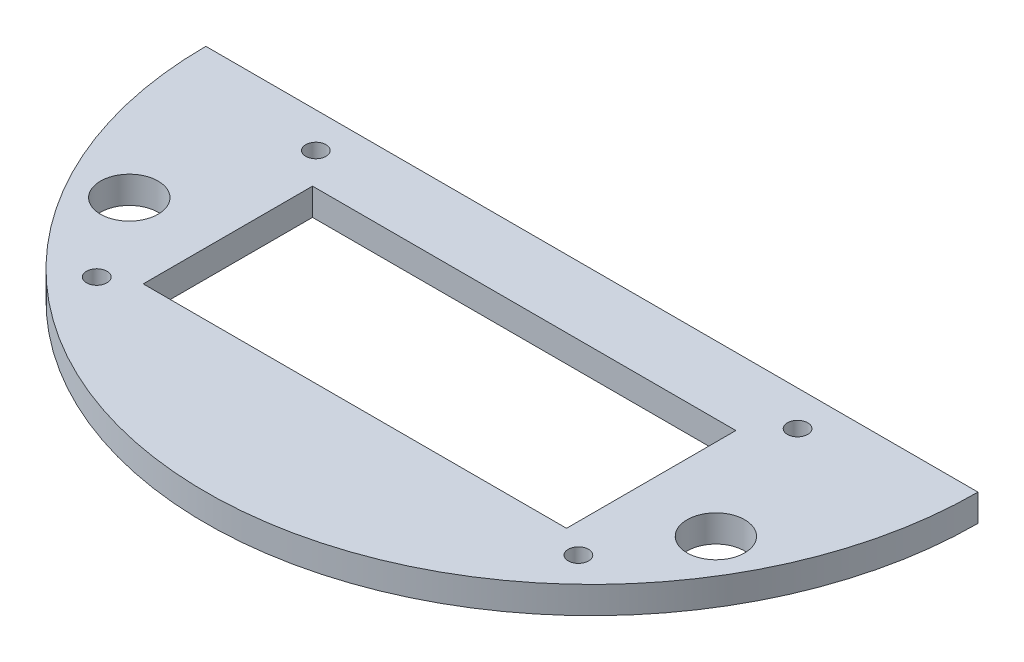
ISO-10303-21;
HEADER;
FILE_DESCRIPTION(('STEP AP214'),'2;1');
FILE_NAME('part.step','',(''),(''),'','','');
FILE_SCHEMA(('AUTOMOTIVE_DESIGN { 1 0 10303 214 1 1 1 1 }'));
ENDSEC;
DATA;
#1=APPLICATION_CONTEXT('core data for automotive mechanical design processes');
#2=APPLICATION_PROTOCOL_DEFINITION('international standard','automotive_design',2000,#1);
#3=PRODUCT_CONTEXT('',#1,'mechanical');
#4=PRODUCT('Part','Part','',(#3));
#5=PRODUCT_RELATED_PRODUCT_CATEGORY('part','',(#4));
#6=PRODUCT_DEFINITION_FORMATION('','',#4);
#7=PRODUCT_DEFINITION_CONTEXT('part definition',#1,'design');
#8=PRODUCT_DEFINITION('design','',#6,#7);
#9=PRODUCT_DEFINITION_SHAPE('','',#8);
#10=(LENGTH_UNIT() NAMED_UNIT(*) SI_UNIT(.MILLI.,.METRE.));
#11=(NAMED_UNIT(*) PLANE_ANGLE_UNIT() SI_UNIT($,.RADIAN.));
#12=(NAMED_UNIT(*) SI_UNIT($,.STERADIAN.) SOLID_ANGLE_UNIT());
#13=UNCERTAINTY_MEASURE_WITH_UNIT(LENGTH_MEASURE(1.E-05),#10,'distance_accuracy_value','');
#14=(GEOMETRIC_REPRESENTATION_CONTEXT(3) GLOBAL_UNCERTAINTY_ASSIGNED_CONTEXT((#13)) GLOBAL_UNIT_ASSIGNED_CONTEXT((#10,
#11,#12)) REPRESENTATION_CONTEXT('',''));
#15=CARTESIAN_POINT('',(0.,0.,0.));
#16=DIRECTION('',(0.,0.,1.));
#17=DIRECTION('',(1.,0.,0.));
#18=AXIS2_PLACEMENT_3D('',#15,#16,#17);
#19=CARTESIAN_POINT('',(0.,4.,0.));
#20=DIRECTION('',(0.,1.,0.));
#21=DIRECTION('',(0.,0.,1.));
#22=AXIS2_PLACEMENT_3D('',#19,#20,#21);
#23=PLANE('',#22);
#24=CARTESIAN_POINT('',(35.5570716121792,4.,37.5545789256541));
#25=DIRECTION('',(0.,1.,0.));
#26=DIRECTION('',(0.,0.,1.));
#27=AXIS2_PLACEMENT_3D('',#24,#25,#26);
#28=CIRCLE('',#27,1.5);
#29=CARTESIAN_POINT('',(35.5570716121792,4.,39.0545789256541));
#30=VERTEX_POINT('',#29);
#31=EDGE_CURVE('E313',#30,#30,#28,.T.);
#32=ORIENTED_EDGE('',*,*,#31,.F.);
#33=EDGE_LOOP('',(#32));
#34=FACE_BOUND('',#33,.T.);
#35=CARTESIAN_POINT('',(-35.5570716121792,4.,37.5545789256541));
#36=DIRECTION('',(0.,1.,0.));
#37=DIRECTION('',(0.,0.,1.));
#38=AXIS2_PLACEMENT_3D('',#35,#36,#37);
#39=CIRCLE('',#38,1.5);
#40=CARTESIAN_POINT('',(-35.5570716121792,4.,39.0545789256541));
#41=VERTEX_POINT('',#40);
#42=EDGE_CURVE('E307',#41,#41,#39,.T.);
#43=ORIENTED_EDGE('',*,*,#42,.F.);
#44=EDGE_LOOP('',(#43));
#45=FACE_BOUND('',#44,.T.);
#46=CARTESIAN_POINT('',(-35.5570716121792,4.,5.19850640774449));
#47=DIRECTION('',(0.,1.,0.));
#48=DIRECTION('',(0.,0.,1.));
#49=AXIS2_PLACEMENT_3D('',#46,#47,#48);
#50=CIRCLE('',#49,1.5);
#51=CARTESIAN_POINT('',(-35.5570716121792,4.,6.69850640774449));
#52=VERTEX_POINT('',#51);
#53=EDGE_CURVE('E301',#52,#52,#50,.T.);
#54=ORIENTED_EDGE('',*,*,#53,.F.);
#55=EDGE_LOOP('',(#54));
#56=FACE_BOUND('',#55,.T.);
#57=CARTESIAN_POINT('',(35.5570716121792,4.,5.19850640774448));
#58=DIRECTION('',(0.,1.,0.));
#59=DIRECTION('',(0.,0.,1.));
#60=AXIS2_PLACEMENT_3D('',#57,#58,#59);
#61=CIRCLE('',#60,1.5);
#62=CARTESIAN_POINT('',(35.5570716121792,4.,6.69850640774448));
#63=VERTEX_POINT('',#62);
#64=EDGE_CURVE('E290',#63,#63,#61,.T.);
#65=ORIENTED_EDGE('',*,*,#64,.F.);
#66=EDGE_LOOP('',(#65));
#67=FACE_BOUND('',#66,.T.);
#68=CARTESIAN_POINT('',(43.3012701892219,4.,25.0000000000002));
#69=DIRECTION('',(0.,1.,0.));
#70=DIRECTION('',(0.,0.,1.));
#71=AXIS2_PLACEMENT_3D('',#68,#69,#70);
#72=CIRCLE('',#71,4.25);
#73=CARTESIAN_POINT('',(43.3012701892219,4.,29.2500000000002));
#74=VERTEX_POINT('',#73);
#75=EDGE_CURVE('E115',#74,#74,#72,.T.);
#76=ORIENTED_EDGE('',*,*,#75,.F.);
#77=EDGE_LOOP('',(#76));
#78=FACE_BOUND('',#77,.T.);
#79=CARTESIAN_POINT('',(0.,4.,0.));
#80=DIRECTION('',(0.,1.,0.));
#81=DIRECTION('',(0.,0.,1.));
#82=AXIS2_PLACEMENT_3D('',#79,#80,#81);
#83=CIRCLE('',#82,57.);
#84=CARTESIAN_POINT('',(-57.,4.,0.));
#85=VERTEX_POINT('',#84);
#86=CARTESIAN_POINT('',(57.,4.,0.));
#87=VERTEX_POINT('',#86);
#88=EDGE_CURVE('E125',#85,#87,#83,.T.);
#89=ORIENTED_EDGE('',*,*,#88,.T.);
#90=DIRECTION('',(-1.,0.,0.));
#91=VECTOR('',#90,1.);
#92=CARTESIAN_POINT('',(-57.,4.,0.));
#93=LINE('',#92,#91);
#94=EDGE_CURVE('E128',#87,#85,#93,.T.);
#95=ORIENTED_EDGE('',*,*,#94,.T.);
#96=EDGE_LOOP('',(#89,#95));
#97=FACE_BOUND('',#96,.T.);
#98=DIRECTION('',(-1.,0.,0.));
#99=VECTOR('',#98,1.);
#100=CARTESIAN_POINT('',(-31.25,4.,9.99999999999999));
#101=LINE('',#100,#99);
#102=CARTESIAN_POINT('',(31.25,4.,9.99999999999999));
#103=VERTEX_POINT('',#102);
#104=CARTESIAN_POINT('',(-31.25,4.,9.99999999999999));
#105=VERTEX_POINT('',#104);
#106=EDGE_CURVE('E94',#103,#105,#101,.T.);
#107=ORIENTED_EDGE('',*,*,#106,.F.);
#108=DIRECTION('',(0.,0.,-1.));
#109=VECTOR('',#108,1.);
#110=CARTESIAN_POINT('',(31.25,4.,9.99999999999999));
#111=LINE('',#110,#109);
#112=CARTESIAN_POINT('',(31.25,4.,35.));
#113=VERTEX_POINT('',#112);
#114=EDGE_CURVE('E86',#113,#103,#111,.T.);
#115=ORIENTED_EDGE('',*,*,#114,.F.);
#116=DIRECTION('',(1.,0.,0.));
#117=VECTOR('',#116,1.);
#118=CARTESIAN_POINT('',(-31.25,4.,35.));
#119=LINE('',#118,#117);
#120=CARTESIAN_POINT('',(-31.25,4.,35.));
#121=VERTEX_POINT('',#120);
#122=EDGE_CURVE('E109',#121,#113,#119,.T.);
#123=ORIENTED_EDGE('',*,*,#122,.F.);
#124=DIRECTION('',(0.,0.,1.));
#125=VECTOR('',#124,1.);
#126=CARTESIAN_POINT('',(-31.25,4.,9.99999999999999));
#127=LINE('',#126,#125);
#128=EDGE_CURVE('E107',#105,#121,#127,.T.);
#129=ORIENTED_EDGE('',*,*,#128,.F.);
#130=EDGE_LOOP('',(#107,#115,#123,#129));
#131=FACE_BOUND('',#130,.T.);
#132=CARTESIAN_POINT('',(-43.3012701892219,4.,25.0000000000001));
#133=DIRECTION('',(0.,1.,0.));
#134=DIRECTION('',(0.,0.,1.));
#135=AXIS2_PLACEMENT_3D('',#132,#133,#134);
#136=CIRCLE('',#135,4.25);
#137=CARTESIAN_POINT('',(-43.3012701892219,4.,29.2500000000001));
#138=VERTEX_POINT('',#137);
#139=EDGE_CURVE('E284',#138,#138,#136,.T.);
#140=ORIENTED_EDGE('',*,*,#139,.F.);
#141=EDGE_LOOP('',(#140));
#142=FACE_BOUND('',#141,.T.);
#143=ADVANCED_FACE('F33',(#34,#45,#56,#67,#78,#97,#131,#142),#23,.T.);
#144=CARTESIAN_POINT('',(0.,0.,0.));
#145=DIRECTION('',(0.,1.,0.));
#146=DIRECTION('',(0.,0.,1.));
#147=AXIS2_PLACEMENT_3D('',#144,#145,#146);
#148=PLANE('',#147);
#149=CARTESIAN_POINT('',(35.5570716121792,0.,37.5545789256541));
#150=DIRECTION('',(0.,1.,0.));
#151=DIRECTION('',(0.,0.,1.));
#152=AXIS2_PLACEMENT_3D('',#149,#150,#151);
#153=CIRCLE('',#152,1.5);
#154=CARTESIAN_POINT('',(35.5570716121792,0.,39.0545789256541));
#155=VERTEX_POINT('',#154);
#156=EDGE_CURVE('E299',#155,#155,#153,.T.);
#157=ORIENTED_EDGE('',*,*,#156,.T.);
#158=EDGE_LOOP('',(#157));
#159=FACE_BOUND('',#158,.T.);
#160=CARTESIAN_POINT('',(-35.5570716121792,0.,37.5545789256541));
#161=DIRECTION('',(0.,1.,0.));
#162=DIRECTION('',(0.,0.,1.));
#163=AXIS2_PLACEMENT_3D('',#160,#161,#162);
#164=CIRCLE('',#163,1.5);
#165=CARTESIAN_POINT('',(-35.5570716121792,0.,39.0545789256541));
#166=VERTEX_POINT('',#165);
#167=EDGE_CURVE('E310',#166,#166,#164,.T.);
#168=ORIENTED_EDGE('',*,*,#167,.T.);
#169=EDGE_LOOP('',(#168));
#170=FACE_BOUND('',#169,.T.);
#171=CARTESIAN_POINT('',(-35.5570716121792,0.,5.19850640774449));
#172=DIRECTION('',(0.,1.,0.));
#173=DIRECTION('',(0.,0.,1.));
#174=AXIS2_PLACEMENT_3D('',#171,#172,#173);
#175=CIRCLE('',#174,1.5);
#176=CARTESIAN_POINT('',(-35.5570716121792,0.,6.69850640774449));
#177=VERTEX_POINT('',#176);
#178=EDGE_CURVE('E304',#177,#177,#175,.T.);
#179=ORIENTED_EDGE('',*,*,#178,.T.);
#180=EDGE_LOOP('',(#179));
#181=FACE_BOUND('',#180,.T.);
#182=CARTESIAN_POINT('',(35.5570716121792,0.,5.19850640774448));
#183=DIRECTION('',(0.,1.,0.));
#184=DIRECTION('',(0.,0.,1.));
#185=AXIS2_PLACEMENT_3D('',#182,#183,#184);
#186=CIRCLE('',#185,1.5);
#187=CARTESIAN_POINT('',(35.5570716121792,0.,6.69850640774448));
#188=VERTEX_POINT('',#187);
#189=EDGE_CURVE('E285',#188,#188,#186,.T.);
#190=ORIENTED_EDGE('',*,*,#189,.T.);
#191=EDGE_LOOP('',(#190));
#192=FACE_BOUND('',#191,.T.);
#193=CARTESIAN_POINT('',(0.,0.,0.));
#194=DIRECTION('',(0.,1.,0.));
#195=DIRECTION('',(0.,0.,1.));
#196=AXIS2_PLACEMENT_3D('',#193,#194,#195);
#197=CIRCLE('',#196,57.);
#198=CARTESIAN_POINT('',(-57.,0.,0.));
#199=VERTEX_POINT('',#198);
#200=CARTESIAN_POINT('',(57.,0.,0.));
#201=VERTEX_POINT('',#200);
#202=EDGE_CURVE('E102',#199,#201,#197,.T.);
#203=ORIENTED_EDGE('',*,*,#202,.F.);
#204=DIRECTION('',(-1.,0.,0.));
#205=VECTOR('',#204,1.);
#206=CARTESIAN_POINT('',(-57.,0.,0.));
#207=LINE('',#206,#205);
#208=EDGE_CURVE('E129',#201,#199,#207,.T.);
#209=ORIENTED_EDGE('',*,*,#208,.F.);
#210=EDGE_LOOP('',(#203,#209));
#211=FACE_BOUND('',#210,.T.);
#212=DIRECTION('',(0.,0.,-1.));
#213=VECTOR('',#212,1.);
#214=CARTESIAN_POINT('',(31.25,0.,9.99999999999999));
#215=LINE('',#214,#213);
#216=CARTESIAN_POINT('',(31.25,0.,35.));
#217=VERTEX_POINT('',#216);
#218=CARTESIAN_POINT('',(31.25,0.,9.99999999999999));
#219=VERTEX_POINT('',#218);
#220=EDGE_CURVE('E56',#217,#219,#215,.T.);
#221=ORIENTED_EDGE('',*,*,#220,.T.);
#222=DIRECTION('',(-1.,0.,0.));
#223=VECTOR('',#222,1.);
#224=CARTESIAN_POINT('',(-31.25,0.,9.99999999999999));
#225=LINE('',#224,#223);
#226=CARTESIAN_POINT('',(-31.25,0.,9.99999999999999));
#227=VERTEX_POINT('',#226);
#228=EDGE_CURVE('E101',#219,#227,#225,.T.);
#229=ORIENTED_EDGE('',*,*,#228,.T.);
#230=DIRECTION('',(0.,0.,1.));
#231=VECTOR('',#230,1.);
#232=CARTESIAN_POINT('',(-31.25,0.,9.99999999999999));
#233=LINE('',#232,#231);
#234=CARTESIAN_POINT('',(-31.25,0.,35.));
#235=VERTEX_POINT('',#234);
#236=EDGE_CURVE('E117',#227,#235,#233,.T.);
#237=ORIENTED_EDGE('',*,*,#236,.T.);
#238=DIRECTION('',(1.,0.,0.));
#239=VECTOR('',#238,1.);
#240=CARTESIAN_POINT('',(-31.25,0.,35.));
#241=LINE('',#240,#239);
#242=EDGE_CURVE('E95',#235,#217,#241,.T.);
#243=ORIENTED_EDGE('',*,*,#242,.T.);
#244=EDGE_LOOP('',(#221,#229,#237,#243));
#245=FACE_BOUND('',#244,.T.);
#246=CARTESIAN_POINT('',(43.3012701892219,0.,25.0000000000002));
#247=DIRECTION('',(0.,1.,0.));
#248=DIRECTION('',(0.,0.,1.));
#249=AXIS2_PLACEMENT_3D('',#246,#247,#248);
#250=CIRCLE('',#249,4.25);
#251=CARTESIAN_POINT('',(43.3012701892219,0.,29.2500000000002));
#252=VERTEX_POINT('',#251);
#253=EDGE_CURVE('E279',#252,#252,#250,.T.);
#254=ORIENTED_EDGE('',*,*,#253,.T.);
#255=EDGE_LOOP('',(#254));
#256=FACE_BOUND('',#255,.T.);
#257=CARTESIAN_POINT('',(-43.3012701892219,0.,25.0000000000001));
#258=DIRECTION('',(0.,1.,0.));
#259=DIRECTION('',(0.,0.,1.));
#260=AXIS2_PLACEMENT_3D('',#257,#258,#259);
#261=CIRCLE('',#260,4.25);
#262=CARTESIAN_POINT('',(-43.3012701892219,0.,29.2500000000001));
#263=VERTEX_POINT('',#262);
#264=EDGE_CURVE('E282',#263,#263,#261,.T.);
#265=ORIENTED_EDGE('',*,*,#264,.T.);
#266=EDGE_LOOP('',(#265));
#267=FACE_BOUND('',#266,.T.);
#268=ADVANCED_FACE('F141',(#159,#170,#181,#192,#211,#245,#256,#267),#148,.F.);
#269=CARTESIAN_POINT('',(0.,4.,0.));
#270=DIRECTION('',(0.,-1.,0.));
#271=DIRECTION('',(0.,0.,-1.));
#272=AXIS2_PLACEMENT_3D('',#269,#270,#271);
#273=CYLINDRICAL_SURFACE('',#272,57.);
#274=ORIENTED_EDGE('',*,*,#202,.T.);
#275=DIRECTION('',(0.,-1.,0.));
#276=VECTOR('',#275,1.);
#277=CARTESIAN_POINT('',(57.,4.,0.));
#278=LINE('',#277,#276);
#279=EDGE_CURVE('E11',#87,#201,#278,.T.);
#280=ORIENTED_EDGE('',*,*,#279,.F.);
#281=ORIENTED_EDGE('',*,*,#88,.F.);
#282=DIRECTION('',(0.,-1.,0.));
#283=VECTOR('',#282,1.);
#284=CARTESIAN_POINT('',(-57.,4.,0.));
#285=LINE('',#284,#283);
#286=EDGE_CURVE('E41',#85,#199,#285,.T.);
#287=ORIENTED_EDGE('',*,*,#286,.T.);
#288=EDGE_LOOP('',(#274,#280,#281,#287));
#289=FACE_BOUND('',#288,.T.);
#290=ADVANCED_FACE('F35',(#289),#273,.T.);
#291=CARTESIAN_POINT('',(-57.,4.,0.));
#292=DIRECTION('',(0.,0.,1.));
#293=DIRECTION('',(1.,0.,0.));
#294=AXIS2_PLACEMENT_3D('',#291,#292,#293);
#295=PLANE('',#294);
#296=ORIENTED_EDGE('',*,*,#208,.T.);
#297=ORIENTED_EDGE('',*,*,#286,.F.);
#298=ORIENTED_EDGE('',*,*,#94,.F.);
#299=ORIENTED_EDGE('',*,*,#279,.T.);
#300=EDGE_LOOP('',(#296,#297,#298,#299));
#301=FACE_BOUND('',#300,.T.);
#302=ADVANCED_FACE('F143',(#301),#295,.F.);
#303=CARTESIAN_POINT('',(31.25,4.,9.99999999999999));
#304=DIRECTION('',(-1.,0.,0.));
#305=DIRECTION('',(0.,0.,1.));
#306=AXIS2_PLACEMENT_3D('',#303,#304,#305);
#307=PLANE('',#306);
#308=ORIENTED_EDGE('',*,*,#220,.F.);
#309=DIRECTION('',(0.,-1.,0.));
#310=VECTOR('',#309,1.);
#311=CARTESIAN_POINT('',(31.25,4.,35.));
#312=LINE('',#311,#310);
#313=EDGE_CURVE('E90',#113,#217,#312,.T.);
#314=ORIENTED_EDGE('',*,*,#313,.F.);
#315=ORIENTED_EDGE('',*,*,#114,.T.);
#316=DIRECTION('',(0.,-1.,0.));
#317=VECTOR('',#316,1.);
#318=CARTESIAN_POINT('',(31.25,4.,9.99999999999999));
#319=LINE('',#318,#317);
#320=EDGE_CURVE('E89',#103,#219,#319,.T.);
#321=ORIENTED_EDGE('',*,*,#320,.T.);
#322=EDGE_LOOP('',(#308,#314,#315,#321));
#323=FACE_BOUND('',#322,.T.);
#324=ADVANCED_FACE('F88',(#323),#307,.T.);
#325=CARTESIAN_POINT('',(-31.25,4.,9.99999999999999));
#326=DIRECTION('',(0.,0.,1.));
#327=DIRECTION('',(1.,0.,0.));
#328=AXIS2_PLACEMENT_3D('',#325,#326,#327);
#329=PLANE('',#328);
#330=ORIENTED_EDGE('',*,*,#228,.F.);
#331=ORIENTED_EDGE('',*,*,#320,.F.);
#332=ORIENTED_EDGE('',*,*,#106,.T.);
#333=DIRECTION('',(0.,-1.,0.));
#334=VECTOR('',#333,1.);
#335=CARTESIAN_POINT('',(-31.25,4.,9.99999999999999));
#336=LINE('',#335,#334);
#337=EDGE_CURVE('E103',#105,#227,#336,.T.);
#338=ORIENTED_EDGE('',*,*,#337,.T.);
#339=EDGE_LOOP('',(#330,#331,#332,#338));
#340=FACE_BOUND('',#339,.T.);
#341=ADVANCED_FACE('F98',(#340),#329,.T.);
#342=CARTESIAN_POINT('',(-31.25,4.,9.99999999999999));
#343=DIRECTION('',(1.,0.,0.));
#344=DIRECTION('',(0.,0.,-1.));
#345=AXIS2_PLACEMENT_3D('',#342,#343,#344);
#346=PLANE('',#345);
#347=ORIENTED_EDGE('',*,*,#236,.F.);
#348=ORIENTED_EDGE('',*,*,#337,.F.);
#349=ORIENTED_EDGE('',*,*,#128,.T.);
#350=DIRECTION('',(0.,-1.,0.));
#351=VECTOR('',#350,1.);
#352=CARTESIAN_POINT('',(-31.25,4.,35.));
#353=LINE('',#352,#351);
#354=EDGE_CURVE('E48',#121,#235,#353,.T.);
#355=ORIENTED_EDGE('',*,*,#354,.T.);
#356=EDGE_LOOP('',(#347,#348,#349,#355));
#357=FACE_BOUND('',#356,.T.);
#358=ADVANCED_FACE('F230',(#357),#346,.T.);
#359=CARTESIAN_POINT('',(-31.25,4.,35.));
#360=DIRECTION('',(0.,0.,-1.));
#361=DIRECTION('',(-1.,0.,0.));
#362=AXIS2_PLACEMENT_3D('',#359,#360,#361);
#363=PLANE('',#362);
#364=ORIENTED_EDGE('',*,*,#242,.F.);
#365=ORIENTED_EDGE('',*,*,#354,.F.);
#366=ORIENTED_EDGE('',*,*,#122,.T.);
#367=ORIENTED_EDGE('',*,*,#313,.T.);
#368=EDGE_LOOP('',(#364,#365,#366,#367));
#369=FACE_BOUND('',#368,.T.);
#370=ADVANCED_FACE('F226',(#369),#363,.T.);
#371=CARTESIAN_POINT('',(43.3012701892219,4.,25.0000000000002));
#372=DIRECTION('',(0.,-1.,0.));
#373=DIRECTION('',(0.,0.,-1.));
#374=AXIS2_PLACEMENT_3D('',#371,#372,#373);
#375=CYLINDRICAL_SURFACE('',#374,4.25);
#376=ORIENTED_EDGE('',*,*,#75,.T.);
#377=EDGE_LOOP('',(#376));
#378=FACE_BOUND('',#377,.T.);
#379=ORIENTED_EDGE('',*,*,#253,.F.);
#380=EDGE_LOOP('',(#379));
#381=FACE_BOUND('',#380,.T.);
#382=ADVANCED_FACE('F222',(#378,#381),#375,.F.);
#383=CARTESIAN_POINT('',(-43.3012701892219,4.,25.0000000000001));
#384=DIRECTION('',(0.,-1.,0.));
#385=DIRECTION('',(0.,0.,-1.));
#386=AXIS2_PLACEMENT_3D('',#383,#384,#385);
#387=CYLINDRICAL_SURFACE('',#386,4.25);
#388=ORIENTED_EDGE('',*,*,#139,.T.);
#389=EDGE_LOOP('',(#388));
#390=FACE_BOUND('',#389,.T.);
#391=ORIENTED_EDGE('',*,*,#264,.F.);
#392=EDGE_LOOP('',(#391));
#393=FACE_BOUND('',#392,.T.);
#394=ADVANCED_FACE('F182',(#390,#393),#387,.F.);
#395=CARTESIAN_POINT('',(35.5570716121792,0.,5.19850640774448));
#396=DIRECTION('',(0.,1.,0.));
#397=DIRECTION('',(0.,0.,1.));
#398=AXIS2_PLACEMENT_3D('',#395,#396,#397);
#399=CYLINDRICAL_SURFACE('',#398,1.5);
#400=ORIENTED_EDGE('',*,*,#189,.F.);
#401=EDGE_LOOP('',(#400));
#402=FACE_BOUND('',#401,.T.);
#403=ORIENTED_EDGE('',*,*,#64,.T.);
#404=EDGE_LOOP('',(#403));
#405=FACE_BOUND('',#404,.T.);
#406=ADVANCED_FACE('F176',(#402,#405),#399,.F.);
#407=CARTESIAN_POINT('',(-35.5570716121792,0.,5.19850640774449));
#408=DIRECTION('',(0.,1.,0.));
#409=DIRECTION('',(0.,0.,1.));
#410=AXIS2_PLACEMENT_3D('',#407,#408,#409);
#411=CYLINDRICAL_SURFACE('',#410,1.5);
#412=ORIENTED_EDGE('',*,*,#178,.F.);
#413=EDGE_LOOP('',(#412));
#414=FACE_BOUND('',#413,.T.);
#415=ORIENTED_EDGE('',*,*,#53,.T.);
#416=EDGE_LOOP('',(#415));
#417=FACE_BOUND('',#416,.T.);
#418=ADVANCED_FACE('F181',(#414,#417),#411,.F.);
#419=CARTESIAN_POINT('',(-35.5570716121792,0.,37.5545789256541));
#420=DIRECTION('',(0.,1.,0.));
#421=DIRECTION('',(0.,0.,1.));
#422=AXIS2_PLACEMENT_3D('',#419,#420,#421);
#423=CYLINDRICAL_SURFACE('',#422,1.5);
#424=ORIENTED_EDGE('',*,*,#167,.F.);
#425=EDGE_LOOP('',(#424));
#426=FACE_BOUND('',#425,.T.);
#427=ORIENTED_EDGE('',*,*,#42,.T.);
#428=EDGE_LOOP('',(#427));
#429=FACE_BOUND('',#428,.T.);
#430=ADVANCED_FACE('F194',(#426,#429),#423,.F.);
#431=CARTESIAN_POINT('',(35.5570716121792,0.,37.5545789256541));
#432=DIRECTION('',(0.,1.,0.));
#433=DIRECTION('',(0.,0.,1.));
#434=AXIS2_PLACEMENT_3D('',#431,#432,#433);
#435=CYLINDRICAL_SURFACE('',#434,1.5);
#436=ORIENTED_EDGE('',*,*,#156,.F.);
#437=EDGE_LOOP('',(#436));
#438=FACE_BOUND('',#437,.T.);
#439=ORIENTED_EDGE('',*,*,#31,.T.);
#440=EDGE_LOOP('',(#439));
#441=FACE_BOUND('',#440,.T.);
#442=ADVANCED_FACE('F204',(#438,#441),#435,.F.);
#443=CLOSED_SHELL('',(#143,#268,#290,#302,#324,#341,#358,#370,#382,#394,#406,#418,#430,#442));
#444=MANIFOLD_SOLID_BREP('B2',#443);
#445=ADVANCED_BREP_SHAPE_REPRESENTATION('',(#18,#444),#14);
#446=SHAPE_DEFINITION_REPRESENTATION(#9,#445);
ENDSEC;
END-ISO-10303-21;
